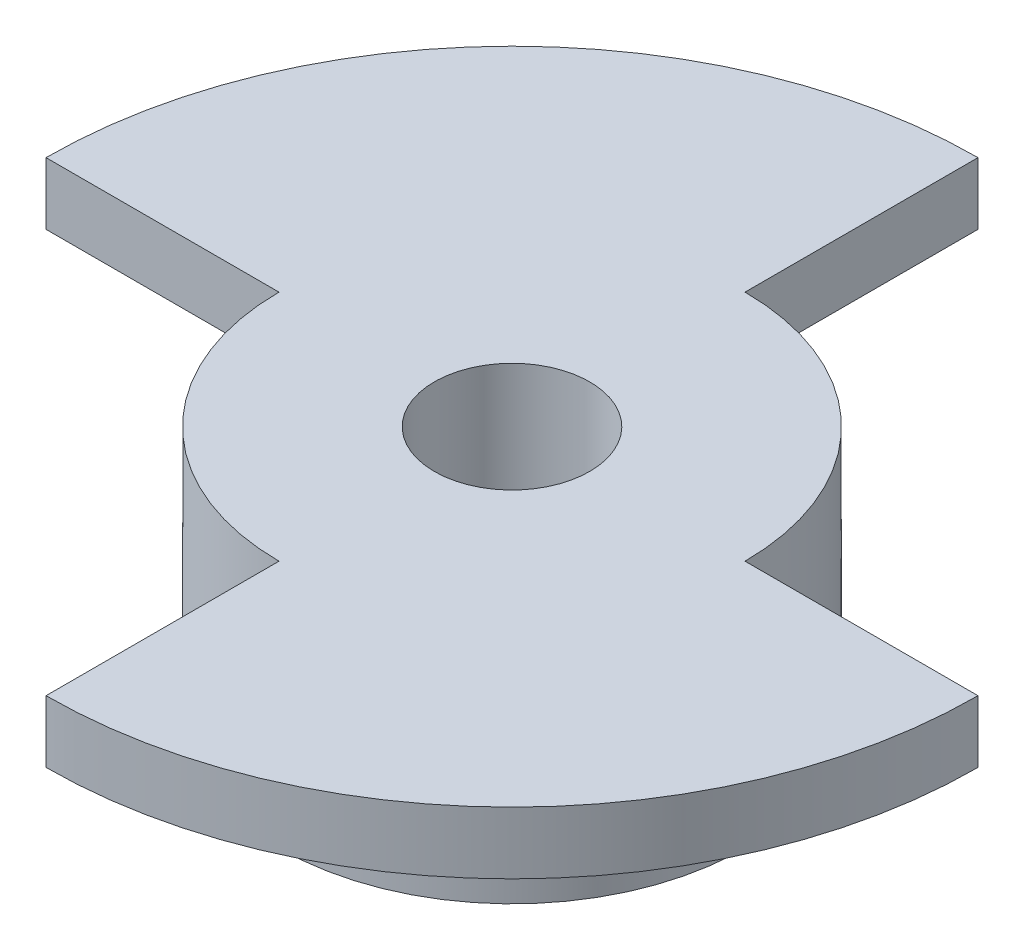
ISO-10303-21;
HEADER;
FILE_DESCRIPTION(('STEP AP214'),'2;1');
FILE_NAME('part.step','',(''),(''),'','','');
FILE_SCHEMA(('AUTOMOTIVE_DESIGN { 1 0 10303 214 1 1 1 1 }'));
ENDSEC;
DATA;
#1=APPLICATION_CONTEXT('core data for automotive mechanical design processes');
#2=APPLICATION_PROTOCOL_DEFINITION('international standard','automotive_design',2000,#1);
#3=PRODUCT_CONTEXT('',#1,'mechanical');
#4=PRODUCT('Part','Part','',(#3));
#5=PRODUCT_RELATED_PRODUCT_CATEGORY('part','',(#4));
#6=PRODUCT_DEFINITION_FORMATION('','',#4);
#7=PRODUCT_DEFINITION_CONTEXT('part definition',#1,'design');
#8=PRODUCT_DEFINITION('design','',#6,#7);
#9=PRODUCT_DEFINITION_SHAPE('','',#8);
#10=(LENGTH_UNIT() NAMED_UNIT(*) SI_UNIT(.MILLI.,.METRE.));
#11=(NAMED_UNIT(*) PLANE_ANGLE_UNIT() SI_UNIT($,.RADIAN.));
#12=(NAMED_UNIT(*) SI_UNIT($,.STERADIAN.) SOLID_ANGLE_UNIT());
#13=UNCERTAINTY_MEASURE_WITH_UNIT(LENGTH_MEASURE(1.E-05),#10,'distance_accuracy_value','');
#14=(GEOMETRIC_REPRESENTATION_CONTEXT(3) GLOBAL_UNCERTAINTY_ASSIGNED_CONTEXT((#13)) GLOBAL_UNIT_ASSIGNED_CONTEXT((#10,
#11,#12)) REPRESENTATION_CONTEXT('',''));
#15=CARTESIAN_POINT('',(0.,0.,0.));
#16=DIRECTION('',(0.,0.,1.));
#17=DIRECTION('',(1.,0.,0.));
#18=AXIS2_PLACEMENT_3D('',#15,#16,#17);
#19=CARTESIAN_POINT('',(0.,24.642857142857,0.));
#20=DIRECTION('',(0.,1.,0.));
#21=DIRECTION('',(0.,0.,1.));
#22=AXIS2_PLACEMENT_3D('',#19,#20,#21);
#23=CYLINDRICAL_SURFACE('',#22,15.);
#24=CARTESIAN_POINT('',(0.,6.,0.));
#25=DIRECTION('',(0.,1.,0.));
#26=DIRECTION('',(0.,0.,1.));
#27=AXIS2_PLACEMENT_3D('',#24,#25,#26);
#28=CIRCLE('',#27,15.);
#29=CARTESIAN_POINT('',(0.,6.,15.));
#30=VERTEX_POINT('',#29);
#31=CARTESIAN_POINT('',(15.,6.,0.));
#32=VERTEX_POINT('',#31);
#33=EDGE_CURVE('E156',#30,#32,#28,.T.);
#34=ORIENTED_EDGE('',*,*,#33,.T.);
#35=DIRECTION('',(0.,1.,0.));
#36=VECTOR('',#35,1.);
#37=CARTESIAN_POINT('',(15.,24.642857142857,0.));
#38=LINE('',#37,#36);
#39=CARTESIAN_POINT('',(15.,8.,0.));
#40=VERTEX_POINT('',#39);
#41=EDGE_CURVE('E149',#32,#40,#38,.T.);
#42=ORIENTED_EDGE('',*,*,#41,.T.);
#43=CARTESIAN_POINT('',(0.,8.,0.));
#44=DIRECTION('',(0.,1.,0.));
#45=DIRECTION('',(0.,0.,1.));
#46=AXIS2_PLACEMENT_3D('',#43,#44,#45);
#47=CIRCLE('',#46,15.);
#48=CARTESIAN_POINT('',(0.,8.,15.));
#49=VERTEX_POINT('',#48);
#50=EDGE_CURVE('E160',#49,#40,#47,.T.);
#51=ORIENTED_EDGE('',*,*,#50,.F.);
#52=DIRECTION('',(0.,1.,0.));
#53=VECTOR('',#52,1.);
#54=CARTESIAN_POINT('',(0.,24.642857142857,15.));
#55=LINE('',#54,#53);
#56=EDGE_CURVE('E141',#49,#30,#55,.F.);
#57=ORIENTED_EDGE('',*,*,#56,.T.);
#58=EDGE_LOOP('',(#34,#42,#51,#57));
#59=FACE_BOUND('',#58,.T.);
#60=ADVANCED_FACE('F34',(#59),#23,.T.);
#61=CARTESIAN_POINT('',(7.5,6.,0.));
#62=DIRECTION('',(0.,1.,0.));
#63=DIRECTION('',(0.,0.,1.));
#64=AXIS2_PLACEMENT_3D('',#61,#62,#63);
#65=PLANE('',#64);
#66=CARTESIAN_POINT('',(0.,6.,0.));
#67=DIRECTION('',(0.,1.,0.));
#68=DIRECTION('',(0.,0.,1.));
#69=AXIS2_PLACEMENT_3D('',#66,#67,#68);
#70=CIRCLE('',#69,7.5);
#71=CARTESIAN_POINT('',(0.,6.,7.5));
#72=VERTEX_POINT('',#71);
#73=CARTESIAN_POINT('',(7.5,6.,0.));
#74=VERTEX_POINT('',#73);
#75=EDGE_CURVE('E152',#72,#74,#70,.T.);
#76=ORIENTED_EDGE('',*,*,#75,.T.);
#77=DIRECTION('',(1.,0.,0.));
#78=VECTOR('',#77,1.);
#79=CARTESIAN_POINT('',(7.5,6.,0.));
#80=LINE('',#79,#78);
#81=EDGE_CURVE('E11',#74,#32,#80,.T.);
#82=ORIENTED_EDGE('',*,*,#81,.T.);
#83=ORIENTED_EDGE('',*,*,#33,.F.);
#84=DIRECTION('',(0.,0.,1.));
#85=VECTOR('',#84,1.);
#86=CARTESIAN_POINT('',(0.,6.,7.5));
#87=LINE('',#86,#85);
#88=EDGE_CURVE('E127',#72,#30,#87,.T.);
#89=ORIENTED_EDGE('',*,*,#88,.F.);
#90=EDGE_LOOP('',(#76,#82,#83,#89));
#91=FACE_BOUND('',#90,.T.);
#92=ADVANCED_FACE('F187',(#91),#65,.F.);
#93=CARTESIAN_POINT('',(0.,24.642857142857,0.));
#94=DIRECTION('',(0.,1.,0.));
#95=DIRECTION('',(0.,0.,1.));
#96=AXIS2_PLACEMENT_3D('',#93,#94,#95);
#97=CYLINDRICAL_SURFACE('',#96,7.5);
#98=ORIENTED_EDGE('',*,*,#75,.F.);
#99=DIRECTION('',(0.,-1.,0.));
#100=VECTOR('',#99,1.);
#101=CARTESIAN_POINT('',(0.,8.,7.5));
#102=LINE('',#101,#100);
#103=CARTESIAN_POINT('',(0.,8.,7.5));
#104=VERTEX_POINT('',#103);
#105=EDGE_CURVE('E57',#104,#72,#102,.T.);
#106=ORIENTED_EDGE('',*,*,#105,.F.);
#107=CARTESIAN_POINT('',(0.,8.,0.));
#108=DIRECTION('',(0.,1.,0.));
#109=DIRECTION('',(0.,0.,-1.));
#110=AXIS2_PLACEMENT_3D('',#107,#108,#109);
#111=CIRCLE('',#110,7.5);
#112=CARTESIAN_POINT('',(-7.5,8.,0.));
#113=VERTEX_POINT('',#112);
#114=EDGE_CURVE('E129',#113,#104,#111,.T.);
#115=ORIENTED_EDGE('',*,*,#114,.F.);
#116=DIRECTION('',(0.,-1.,0.));
#117=VECTOR('',#116,1.);
#118=CARTESIAN_POINT('',(-7.5,8.,0.));
#119=LINE('',#118,#117);
#120=CARTESIAN_POINT('',(-7.5,6.,0.));
#121=VERTEX_POINT('',#120);
#122=EDGE_CURVE('E139',#113,#121,#119,.T.);
#123=ORIENTED_EDGE('',*,*,#122,.T.);
#124=CARTESIAN_POINT('',(0.,6.,-7.5));
#125=VERTEX_POINT('',#124);
#126=EDGE_CURVE('E107',#125,#121,#70,.T.);
#127=ORIENTED_EDGE('',*,*,#126,.F.);
#128=DIRECTION('',(0.,-1.,0.));
#129=VECTOR('',#128,1.);
#130=CARTESIAN_POINT('',(0.,8.,-7.5));
#131=LINE('',#130,#129);
#132=CARTESIAN_POINT('',(0.,8.,-7.5));
#133=VERTEX_POINT('',#132);
#134=EDGE_CURVE('E49',#133,#125,#131,.T.);
#135=ORIENTED_EDGE('',*,*,#134,.F.);
#136=CARTESIAN_POINT('',(0.,8.,0.));
#137=DIRECTION('',(0.,1.,0.));
#138=DIRECTION('',(0.,0.,-1.));
#139=AXIS2_PLACEMENT_3D('',#136,#137,#138);
#140=CIRCLE('',#139,7.5);
#141=CARTESIAN_POINT('',(7.5,8.,0.));
#142=VERTEX_POINT('',#141);
#143=EDGE_CURVE('E103',#142,#133,#140,.T.);
#144=ORIENTED_EDGE('',*,*,#143,.F.);
#145=DIRECTION('',(0.,-1.,0.));
#146=VECTOR('',#145,1.);
#147=CARTESIAN_POINT('',(7.5,8.,0.));
#148=LINE('',#147,#146);
#149=EDGE_CURVE('E108',#142,#74,#148,.T.);
#150=ORIENTED_EDGE('',*,*,#149,.T.);
#151=EDGE_LOOP('',(#98,#106,#115,#123,#127,#135,#144,#150));
#152=FACE_BOUND('',#151,.T.);
#153=CARTESIAN_POINT('',(0.,0.,0.));
#154=DIRECTION('',(0.,1.,0.));
#155=DIRECTION('',(0.,0.,1.));
#156=AXIS2_PLACEMENT_3D('',#153,#154,#155);
#157=CIRCLE('',#156,7.5);
#158=CARTESIAN_POINT('',(0.,0.,7.5));
#159=VERTEX_POINT('',#158);
#160=EDGE_CURVE('E168',#159,#159,#157,.T.);
#161=ORIENTED_EDGE('',*,*,#160,.T.);
#162=EDGE_LOOP('',(#161));
#163=FACE_BOUND('',#162,.T.);
#164=ADVANCED_FACE('F36',(#152,#163),#97,.T.);
#165=CARTESIAN_POINT('',(2.5,0.,0.));
#166=DIRECTION('',(0.,1.,0.));
#167=DIRECTION('',(0.,0.,1.));
#168=AXIS2_PLACEMENT_3D('',#165,#166,#167);
#169=PLANE('',#168);
#170=ORIENTED_EDGE('',*,*,#160,.F.);
#171=EDGE_LOOP('',(#170));
#172=FACE_BOUND('',#171,.T.);
#173=CARTESIAN_POINT('',(0.,0.,0.));
#174=DIRECTION('',(0.,1.,0.));
#175=DIRECTION('',(0.,0.,1.));
#176=AXIS2_PLACEMENT_3D('',#173,#174,#175);
#177=CIRCLE('',#176,2.5);
#178=CARTESIAN_POINT('',(0.,0.,2.5));
#179=VERTEX_POINT('',#178);
#180=EDGE_CURVE('E165',#179,#179,#177,.T.);
#181=ORIENTED_EDGE('',*,*,#180,.T.);
#182=EDGE_LOOP('',(#181));
#183=FACE_BOUND('',#182,.T.);
#184=ADVANCED_FACE('F194',(#172,#183),#169,.F.);
#185=CARTESIAN_POINT('',(0.,24.642857142857,0.));
#186=DIRECTION('',(0.,1.,0.));
#187=DIRECTION('',(0.,0.,1.));
#188=AXIS2_PLACEMENT_3D('',#185,#186,#187);
#189=CYLINDRICAL_SURFACE('',#188,2.5);
#190=ORIENTED_EDGE('',*,*,#180,.F.);
#191=EDGE_LOOP('',(#190));
#192=FACE_BOUND('',#191,.T.);
#193=CARTESIAN_POINT('',(0.,8.,0.));
#194=DIRECTION('',(0.,1.,0.));
#195=DIRECTION('',(0.,0.,1.));
#196=AXIS2_PLACEMENT_3D('',#193,#194,#195);
#197=CIRCLE('',#196,2.5);
#198=CARTESIAN_POINT('',(0.,8.,2.5));
#199=VERTEX_POINT('',#198);
#200=EDGE_CURVE('E162',#199,#199,#197,.T.);
#201=ORIENTED_EDGE('',*,*,#200,.T.);
#202=EDGE_LOOP('',(#201));
#203=FACE_BOUND('',#202,.T.);
#204=ADVANCED_FACE('F206',(#192,#203),#189,.F.);
#205=CARTESIAN_POINT('',(15.,8.,0.));
#206=DIRECTION('',(0.,-1.,0.));
#207=DIRECTION('',(0.,0.,-1.));
#208=AXIS2_PLACEMENT_3D('',#205,#206,#207);
#209=PLANE('',#208);
#210=ORIENTED_EDGE('',*,*,#200,.F.);
#211=EDGE_LOOP('',(#210));
#212=FACE_BOUND('',#211,.T.);
#213=ORIENTED_EDGE('',*,*,#50,.T.);
#214=DIRECTION('',(-1.,0.,0.));
#215=VECTOR('',#214,1.);
#216=CARTESIAN_POINT('',(7.5,8.,0.));
#217=LINE('',#216,#215);
#218=EDGE_CURVE('E109',#40,#142,#217,.T.);
#219=ORIENTED_EDGE('',*,*,#218,.T.);
#220=ORIENTED_EDGE('',*,*,#143,.T.);
#221=DIRECTION('',(0.,0.,-1.));
#222=VECTOR('',#221,1.);
#223=CARTESIAN_POINT('',(0.,8.,-21.9448200159144));
#224=LINE('',#223,#222);
#225=CARTESIAN_POINT('',(0.,8.,-15.));
#226=VERTEX_POINT('',#225);
#227=EDGE_CURVE('E112',#133,#226,#224,.T.);
#228=ORIENTED_EDGE('',*,*,#227,.T.);
#229=CARTESIAN_POINT('',(-15.,8.,0.));
#230=VERTEX_POINT('',#229);
#231=EDGE_CURVE('E159',#226,#230,#47,.T.);
#232=ORIENTED_EDGE('',*,*,#231,.T.);
#233=DIRECTION('',(1.,0.,0.));
#234=VECTOR('',#233,1.);
#235=CARTESIAN_POINT('',(-23.4870721059012,8.,0.));
#236=LINE('',#235,#234);
#237=EDGE_CURVE('E135',#230,#113,#236,.T.);
#238=ORIENTED_EDGE('',*,*,#237,.T.);
#239=ORIENTED_EDGE('',*,*,#114,.T.);
#240=DIRECTION('',(0.,0.,1.));
#241=VECTOR('',#240,1.);
#242=CARTESIAN_POINT('',(0.,8.,7.5));
#243=LINE('',#242,#241);
#244=EDGE_CURVE('E132',#104,#49,#243,.T.);
#245=ORIENTED_EDGE('',*,*,#244,.T.);
#246=EDGE_LOOP('',(#213,#219,#220,#228,#232,#238,#239,#245));
#247=FACE_BOUND('',#246,.T.);
#248=ADVANCED_FACE('F121',(#212,#247),#209,.F.);
#249=ORIENTED_EDGE('',*,*,#231,.F.);
#250=DIRECTION('',(0.,1.,0.));
#251=VECTOR('',#250,1.);
#252=CARTESIAN_POINT('',(0.,24.642857142857,-15.));
#253=LINE('',#252,#251);
#254=CARTESIAN_POINT('',(0.,6.,-15.));
#255=VERTEX_POINT('',#254);
#256=EDGE_CURVE('E115',#226,#255,#253,.F.);
#257=ORIENTED_EDGE('',*,*,#256,.T.);
#258=CARTESIAN_POINT('',(-15.,6.,0.));
#259=VERTEX_POINT('',#258);
#260=EDGE_CURVE('E155',#255,#259,#28,.T.);
#261=ORIENTED_EDGE('',*,*,#260,.T.);
#262=DIRECTION('',(0.,1.,0.));
#263=VECTOR('',#262,1.);
#264=CARTESIAN_POINT('',(-15.,24.642857142857,0.));
#265=LINE('',#264,#263);
#266=EDGE_CURVE('E145',#259,#230,#265,.T.);
#267=ORIENTED_EDGE('',*,*,#266,.T.);
#268=EDGE_LOOP('',(#249,#257,#261,#267));
#269=FACE_BOUND('',#268,.T.);
#270=ADVANCED_FACE('F177',(#269),#23,.T.);
#271=ORIENTED_EDGE('',*,*,#260,.F.);
#272=DIRECTION('',(0.,0.,-1.));
#273=VECTOR('',#272,1.);
#274=CARTESIAN_POINT('',(0.,6.,-21.9448200159144));
#275=LINE('',#274,#273);
#276=EDGE_CURVE('E122',#125,#255,#275,.T.);
#277=ORIENTED_EDGE('',*,*,#276,.F.);
#278=ORIENTED_EDGE('',*,*,#126,.T.);
#279=DIRECTION('',(-1.,0.,0.));
#280=VECTOR('',#279,1.);
#281=CARTESIAN_POINT('',(7.5,6.,0.));
#282=LINE('',#281,#280);
#283=EDGE_CURVE('E42',#121,#259,#282,.T.);
#284=ORIENTED_EDGE('',*,*,#283,.T.);
#285=EDGE_LOOP('',(#271,#277,#278,#284));
#286=FACE_BOUND('',#285,.T.);
#287=ADVANCED_FACE('F174',(#286),#65,.F.);
#288=CARTESIAN_POINT('',(-23.4870721059012,8.,0.));
#289=DIRECTION('',(0.,0.,-1.));
#290=DIRECTION('',(-1.,0.,0.));
#291=AXIS2_PLACEMENT_3D('',#288,#289,#290);
#292=PLANE('',#291);
#293=ORIENTED_EDGE('',*,*,#283,.F.);
#294=ORIENTED_EDGE('',*,*,#122,.F.);
#295=ORIENTED_EDGE('',*,*,#237,.F.);
#296=ORIENTED_EDGE('',*,*,#266,.F.);
#297=EDGE_LOOP('',(#293,#294,#295,#296));
#298=FACE_BOUND('',#297,.T.);
#299=ADVANCED_FACE('F179',(#298),#292,.F.);
#300=CARTESIAN_POINT('',(0.,8.,7.5));
#301=DIRECTION('',(1.,0.,0.));
#302=DIRECTION('',(0.,0.,-1.));
#303=AXIS2_PLACEMENT_3D('',#300,#301,#302);
#304=PLANE('',#303);
#305=ORIENTED_EDGE('',*,*,#244,.F.);
#306=ORIENTED_EDGE('',*,*,#105,.T.);
#307=ORIENTED_EDGE('',*,*,#88,.T.);
#308=ORIENTED_EDGE('',*,*,#56,.F.);
#309=EDGE_LOOP('',(#305,#306,#307,#308));
#310=FACE_BOUND('',#309,.T.);
#311=ADVANCED_FACE('F180',(#310),#304,.F.);
#312=CARTESIAN_POINT('',(7.5,8.,0.));
#313=DIRECTION('',(0.,0.,1.));
#314=DIRECTION('',(1.,0.,0.));
#315=AXIS2_PLACEMENT_3D('',#312,#313,#314);
#316=PLANE('',#315);
#317=ORIENTED_EDGE('',*,*,#81,.F.);
#318=ORIENTED_EDGE('',*,*,#149,.F.);
#319=ORIENTED_EDGE('',*,*,#218,.F.);
#320=ORIENTED_EDGE('',*,*,#41,.F.);
#321=EDGE_LOOP('',(#317,#318,#319,#320));
#322=FACE_BOUND('',#321,.T.);
#323=ADVANCED_FACE('F185',(#322),#316,.F.);
#324=CARTESIAN_POINT('',(0.,8.,-21.9448200159144));
#325=DIRECTION('',(-1.,0.,0.));
#326=DIRECTION('',(0.,0.,1.));
#327=AXIS2_PLACEMENT_3D('',#324,#325,#326);
#328=PLANE('',#327);
#329=ORIENTED_EDGE('',*,*,#227,.F.);
#330=ORIENTED_EDGE('',*,*,#134,.T.);
#331=ORIENTED_EDGE('',*,*,#276,.T.);
#332=ORIENTED_EDGE('',*,*,#256,.F.);
#333=EDGE_LOOP('',(#329,#330,#331,#332));
#334=FACE_BOUND('',#333,.T.);
#335=ADVANCED_FACE('F113',(#334),#328,.F.);
#336=CLOSED_SHELL('',(#60,#92,#164,#184,#204,#248,#270,#287,#299,#311,#323,#335));
#337=MANIFOLD_SOLID_BREP('B2',#336);
#338=ADVANCED_BREP_SHAPE_REPRESENTATION('',(#18,#337),#14);
#339=SHAPE_DEFINITION_REPRESENTATION(#9,#338);
ENDSEC;
END-ISO-10303-21;
